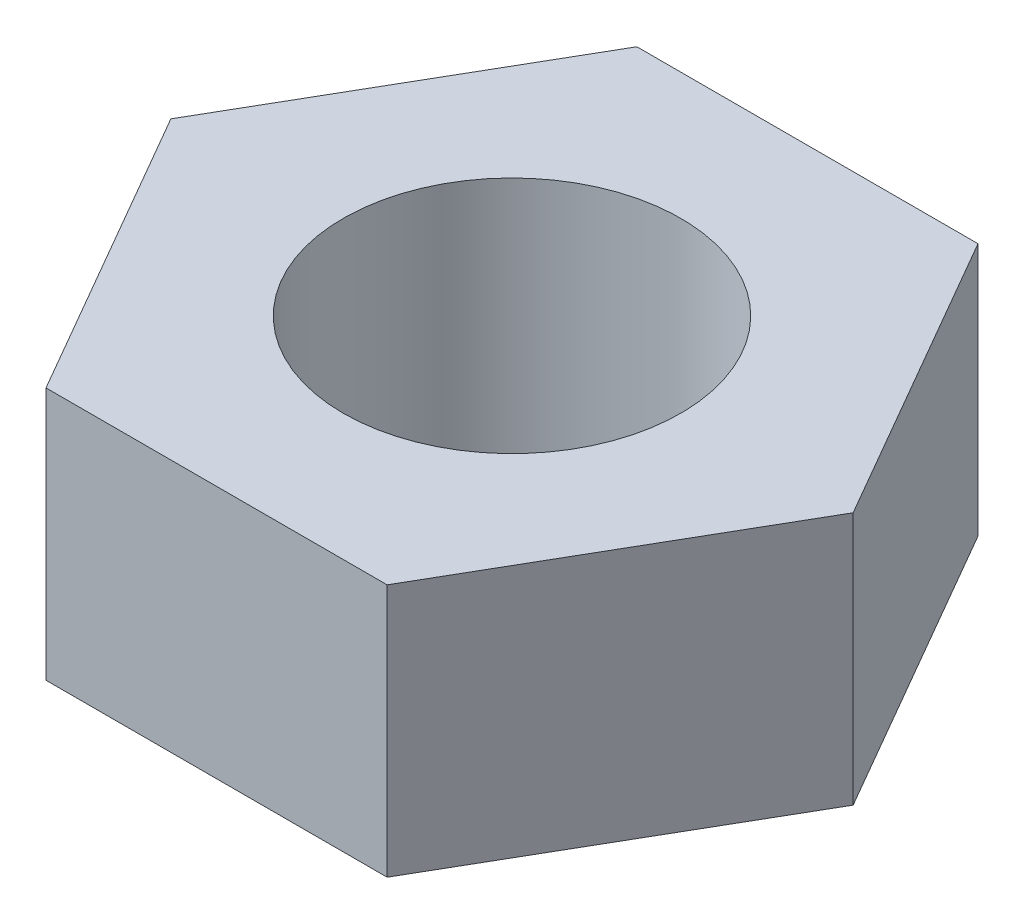
ISO-10303-21;
HEADER;
FILE_DESCRIPTION(('STEP AP214'),'2;1');
FILE_NAME('part.step','',(''),(''),'','','');
FILE_SCHEMA(('AUTOMOTIVE_DESIGN { 1 0 10303 214 1 1 1 1 }'));
ENDSEC;
DATA;
#1=APPLICATION_CONTEXT('core data for automotive mechanical design processes');
#2=APPLICATION_PROTOCOL_DEFINITION('international standard','automotive_design',2000,#1);
#3=PRODUCT_CONTEXT('',#1,'mechanical');
#4=PRODUCT('Part','Part','',(#3));
#5=PRODUCT_RELATED_PRODUCT_CATEGORY('part','',(#4));
#6=PRODUCT_DEFINITION_FORMATION('','',#4);
#7=PRODUCT_DEFINITION_CONTEXT('part definition',#1,'design');
#8=PRODUCT_DEFINITION('design','',#6,#7);
#9=PRODUCT_DEFINITION_SHAPE('','',#8);
#10=(LENGTH_UNIT() NAMED_UNIT(*) SI_UNIT(.MILLI.,.METRE.));
#11=(NAMED_UNIT(*) PLANE_ANGLE_UNIT() SI_UNIT($,.RADIAN.));
#12=(NAMED_UNIT(*) SI_UNIT($,.STERADIAN.) SOLID_ANGLE_UNIT());
#13=UNCERTAINTY_MEASURE_WITH_UNIT(LENGTH_MEASURE(1.E-05),#10,'distance_accuracy_value','');
#14=(GEOMETRIC_REPRESENTATION_CONTEXT(3) GLOBAL_UNCERTAINTY_ASSIGNED_CONTEXT((#13)) GLOBAL_UNIT_ASSIGNED_CONTEXT((#10,
#11,#12)) REPRESENTATION_CONTEXT('',''));
#15=CARTESIAN_POINT('',(0.,0.,0.));
#16=DIRECTION('',(0.,0.,1.));
#17=DIRECTION('',(1.,0.,0.));
#18=AXIS2_PLACEMENT_3D('',#15,#16,#17);
#19=CARTESIAN_POINT('',(0.,3.,0.));
#20=DIRECTION('',(0.,1.,0.));
#21=DIRECTION('',(0.,0.,1.));
#22=AXIS2_PLACEMENT_3D('',#19,#20,#21);
#23=PLANE('',#22);
#24=DIRECTION('',(0.499999999999995,0.,-0.866025403784441));
#25=VECTOR('',#24,1.);
#26=CARTESIAN_POINT('',(2.02072594216373,3.,3.49999999999997));
#27=LINE('',#26,#25);
#28=CARTESIAN_POINT('',(2.02072594216373,3.,3.49999999999997));
#29=VERTEX_POINT('',#28);
#30=CARTESIAN_POINT('',(4.04145188432738,3.,0.));
#31=VERTEX_POINT('',#30);
#32=EDGE_CURVE('E132',#29,#31,#27,.T.);
#33=ORIENTED_EDGE('',*,*,#32,.T.);
#34=DIRECTION('',(-0.500000000000001,0.,-0.866025403784438));
#35=VECTOR('',#34,1.);
#36=CARTESIAN_POINT('',(4.04145188432738,3.,0.));
#37=LINE('',#36,#35);
#38=CARTESIAN_POINT('',(2.02072594216368,3.,-3.5));
#39=VERTEX_POINT('',#38);
#40=EDGE_CURVE('E90',#31,#39,#37,.T.);
#41=ORIENTED_EDGE('',*,*,#40,.T.);
#42=DIRECTION('',(-1.,0.,0.));
#43=VECTOR('',#42,1.);
#44=CARTESIAN_POINT('',(2.02072594216368,3.,-3.5));
#45=LINE('',#44,#43);
#46=CARTESIAN_POINT('',(-2.0207259421637,3.,-3.49999999999999));
#47=VERTEX_POINT('',#46);
#48=EDGE_CURVE('E103',#39,#47,#45,.T.);
#49=ORIENTED_EDGE('',*,*,#48,.T.);
#50=DIRECTION('',(-0.499999999999995,0.,0.866025403784442));
#51=VECTOR('',#50,1.);
#52=CARTESIAN_POINT('',(-2.0207259421637,3.,-3.49999999999999));
#53=LINE('',#52,#51);
#54=CARTESIAN_POINT('',(-4.04145188432738,3.,0.));
#55=VERTEX_POINT('',#54);
#56=EDGE_CURVE('E97',#47,#55,#53,.T.);
#57=ORIENTED_EDGE('',*,*,#56,.T.);
#58=DIRECTION('',(0.500000000000007,0.,0.866025403784435));
#59=VECTOR('',#58,1.);
#60=CARTESIAN_POINT('',(-4.04145188432738,3.,0.));
#61=LINE('',#60,#59);
#62=CARTESIAN_POINT('',(-2.02072594216365,3.,3.50000000000001));
#63=VERTEX_POINT('',#62);
#64=EDGE_CURVE('E101',#55,#63,#61,.T.);
#65=ORIENTED_EDGE('',*,*,#64,.T.);
#66=DIRECTION('',(1.,0.,0.));
#67=VECTOR('',#66,1.);
#68=CARTESIAN_POINT('',(-2.02072594216365,3.,3.50000000000001));
#69=LINE('',#68,#67);
#70=EDGE_CURVE('E53',#63,#29,#69,.T.);
#71=ORIENTED_EDGE('',*,*,#70,.T.);
#72=EDGE_LOOP('',(#33,#41,#49,#57,#65,#71));
#73=FACE_BOUND('',#72,.T.);
#74=CARTESIAN_POINT('',(0.,3.,0.));
#75=DIRECTION('',(0.,1.,0.));
#76=DIRECTION('',(0.,0.,1.));
#77=AXIS2_PLACEMENT_3D('',#74,#75,#76);
#78=CIRCLE('',#77,2.);
#79=CARTESIAN_POINT('',(0.,3.,2.));
#80=VERTEX_POINT('',#79);
#81=EDGE_CURVE('E125',#80,#80,#78,.T.);
#82=ORIENTED_EDGE('',*,*,#81,.F.);
#83=EDGE_LOOP('',(#82));
#84=FACE_BOUND('',#83,.T.);
#85=ADVANCED_FACE('F36',(#73,#84),#23,.T.);
#86=CARTESIAN_POINT('',(0.,0.,0.));
#87=DIRECTION('',(0.,1.,0.));
#88=DIRECTION('',(0.,0.,1.));
#89=AXIS2_PLACEMENT_3D('',#86,#87,#88);
#90=PLANE('',#89);
#91=DIRECTION('',(0.499999999999995,0.,-0.866025403784441));
#92=VECTOR('',#91,1.);
#93=CARTESIAN_POINT('',(2.02072594216373,0.,3.49999999999997));
#94=LINE('',#93,#92);
#95=CARTESIAN_POINT('',(2.02072594216373,0.,3.49999999999997));
#96=VERTEX_POINT('',#95);
#97=CARTESIAN_POINT('',(4.04145188432738,0.,0.));
#98=VERTEX_POINT('',#97);
#99=EDGE_CURVE('E121',#96,#98,#94,.T.);
#100=ORIENTED_EDGE('',*,*,#99,.F.);
#101=DIRECTION('',(1.,0.,0.));
#102=VECTOR('',#101,1.);
#103=CARTESIAN_POINT('',(-2.02072594216365,0.,3.50000000000001));
#104=LINE('',#103,#102);
#105=CARTESIAN_POINT('',(-2.02072594216365,0.,3.50000000000001));
#106=VERTEX_POINT('',#105);
#107=EDGE_CURVE('E82',#106,#96,#104,.T.);
#108=ORIENTED_EDGE('',*,*,#107,.F.);
#109=DIRECTION('',(0.500000000000007,0.,0.866025403784435));
#110=VECTOR('',#109,1.);
#111=CARTESIAN_POINT('',(-4.04145188432738,0.,0.));
#112=LINE('',#111,#110);
#113=CARTESIAN_POINT('',(-4.04145188432738,0.,0.));
#114=VERTEX_POINT('',#113);
#115=EDGE_CURVE('E76',#114,#106,#112,.T.);
#116=ORIENTED_EDGE('',*,*,#115,.F.);
#117=DIRECTION('',(-0.499999999999995,0.,0.866025403784442));
#118=VECTOR('',#117,1.);
#119=CARTESIAN_POINT('',(-2.0207259421637,0.,-3.49999999999999));
#120=LINE('',#119,#118);
#121=CARTESIAN_POINT('',(-2.0207259421637,0.,-3.49999999999999));
#122=VERTEX_POINT('',#121);
#123=EDGE_CURVE('E111',#122,#114,#120,.T.);
#124=ORIENTED_EDGE('',*,*,#123,.F.);
#125=DIRECTION('',(-1.,0.,0.));
#126=VECTOR('',#125,1.);
#127=CARTESIAN_POINT('',(2.02072594216368,0.,-3.5));
#128=LINE('',#127,#126);
#129=CARTESIAN_POINT('',(2.02072594216368,0.,-3.5));
#130=VERTEX_POINT('',#129);
#131=EDGE_CURVE('E127',#130,#122,#128,.T.);
#132=ORIENTED_EDGE('',*,*,#131,.F.);
#133=DIRECTION('',(-0.500000000000001,0.,-0.866025403784438));
#134=VECTOR('',#133,1.);
#135=CARTESIAN_POINT('',(4.04145188432738,0.,0.));
#136=LINE('',#135,#134);
#137=EDGE_CURVE('E124',#98,#130,#136,.T.);
#138=ORIENTED_EDGE('',*,*,#137,.F.);
#139=EDGE_LOOP('',(#100,#108,#116,#124,#132,#138));
#140=FACE_BOUND('',#139,.T.);
#141=CARTESIAN_POINT('',(0.,0.,0.));
#142=DIRECTION('',(0.,1.,0.));
#143=DIRECTION('',(0.,0.,1.));
#144=AXIS2_PLACEMENT_3D('',#141,#142,#143);
#145=CIRCLE('',#144,2.);
#146=CARTESIAN_POINT('',(0.,0.,2.));
#147=VERTEX_POINT('',#146);
#148=EDGE_CURVE('E225',#147,#147,#145,.T.);
#149=ORIENTED_EDGE('',*,*,#148,.T.);
#150=EDGE_LOOP('',(#149));
#151=FACE_BOUND('',#150,.T.);
#152=ADVANCED_FACE('F141',(#140,#151),#90,.F.);
#153=CARTESIAN_POINT('',(2.02072594216373,3.,3.49999999999997));
#154=DIRECTION('',(-0.866025403784441,0.,-0.499999999999995));
#155=DIRECTION('',(-0.499999999999995,0.,0.866025403784441));
#156=AXIS2_PLACEMENT_3D('',#153,#154,#155);
#157=PLANE('',#156);
#158=ORIENTED_EDGE('',*,*,#99,.T.);
#159=DIRECTION('',(0.,-1.,0.));
#160=VECTOR('',#159,1.);
#161=CARTESIAN_POINT('',(4.04145188432738,3.,0.));
#162=LINE('',#161,#160);
#163=EDGE_CURVE('E11',#31,#98,#162,.T.);
#164=ORIENTED_EDGE('',*,*,#163,.F.);
#165=ORIENTED_EDGE('',*,*,#32,.F.);
#166=DIRECTION('',(0.,-1.,0.));
#167=VECTOR('',#166,1.);
#168=CARTESIAN_POINT('',(2.02072594216373,3.,3.49999999999997));
#169=LINE('',#168,#167);
#170=EDGE_CURVE('E117',#29,#96,#169,.T.);
#171=ORIENTED_EDGE('',*,*,#170,.T.);
#172=EDGE_LOOP('',(#158,#164,#165,#171));
#173=FACE_BOUND('',#172,.T.);
#174=ADVANCED_FACE('F38',(#173),#157,.F.);
#175=CARTESIAN_POINT('',(4.04145188432738,3.,0.));
#176=DIRECTION('',(-0.866025403784438,0.,0.500000000000001));
#177=DIRECTION('',(0.500000000000001,0.,0.866025403784438));
#178=AXIS2_PLACEMENT_3D('',#175,#176,#177);
#179=PLANE('',#178);
#180=ORIENTED_EDGE('',*,*,#137,.T.);
#181=DIRECTION('',(0.,-1.,0.));
#182=VECTOR('',#181,1.);
#183=CARTESIAN_POINT('',(2.02072594216368,3.,-3.5));
#184=LINE('',#183,#182);
#185=EDGE_CURVE('E45',#39,#130,#184,.T.);
#186=ORIENTED_EDGE('',*,*,#185,.F.);
#187=ORIENTED_EDGE('',*,*,#40,.F.);
#188=ORIENTED_EDGE('',*,*,#163,.T.);
#189=EDGE_LOOP('',(#180,#186,#187,#188));
#190=FACE_BOUND('',#189,.T.);
#191=ADVANCED_FACE('F166',(#190),#179,.F.);
#192=CARTESIAN_POINT('',(2.02072594216368,3.,-3.5));
#193=DIRECTION('',(0.,0.,1.));
#194=DIRECTION('',(1.,0.,0.));
#195=AXIS2_PLACEMENT_3D('',#192,#193,#194);
#196=PLANE('',#195);
#197=ORIENTED_EDGE('',*,*,#131,.T.);
#198=DIRECTION('',(0.,-1.,0.));
#199=VECTOR('',#198,1.);
#200=CARTESIAN_POINT('',(-2.0207259421637,3.,-3.49999999999999));
#201=LINE('',#200,#199);
#202=EDGE_CURVE('E112',#47,#122,#201,.T.);
#203=ORIENTED_EDGE('',*,*,#202,.F.);
#204=ORIENTED_EDGE('',*,*,#48,.F.);
#205=ORIENTED_EDGE('',*,*,#185,.T.);
#206=EDGE_LOOP('',(#197,#203,#204,#205));
#207=FACE_BOUND('',#206,.T.);
#208=ADVANCED_FACE('F138',(#207),#196,.F.);
#209=CARTESIAN_POINT('',(-2.0207259421637,3.,-3.49999999999999));
#210=DIRECTION('',(0.866025403784441,0.,0.499999999999995));
#211=DIRECTION('',(0.499999999999995,0.,-0.866025403784442));
#212=AXIS2_PLACEMENT_3D('',#209,#210,#211);
#213=PLANE('',#212);
#214=ORIENTED_EDGE('',*,*,#123,.T.);
#215=DIRECTION('',(0.,-1.,0.));
#216=VECTOR('',#215,1.);
#217=CARTESIAN_POINT('',(-4.04145188432738,3.,0.));
#218=LINE('',#217,#216);
#219=EDGE_CURVE('E108',#55,#114,#218,.T.);
#220=ORIENTED_EDGE('',*,*,#219,.F.);
#221=ORIENTED_EDGE('',*,*,#56,.F.);
#222=ORIENTED_EDGE('',*,*,#202,.T.);
#223=EDGE_LOOP('',(#214,#220,#221,#222));
#224=FACE_BOUND('',#223,.T.);
#225=ADVANCED_FACE('F109',(#224),#213,.F.);
#226=CARTESIAN_POINT('',(-4.04145188432738,3.,0.));
#227=DIRECTION('',(0.866025403784434,0.,-0.500000000000007));
#228=DIRECTION('',(-0.500000000000007,0.,-0.866025403784435));
#229=AXIS2_PLACEMENT_3D('',#226,#227,#228);
#230=PLANE('',#229);
#231=ORIENTED_EDGE('',*,*,#115,.T.);
#232=DIRECTION('',(0.,-1.,0.));
#233=VECTOR('',#232,1.);
#234=CARTESIAN_POINT('',(-2.02072594216365,3.,3.50000000000001));
#235=LINE('',#234,#233);
#236=EDGE_CURVE('E113',#63,#106,#235,.T.);
#237=ORIENTED_EDGE('',*,*,#236,.F.);
#238=ORIENTED_EDGE('',*,*,#64,.F.);
#239=ORIENTED_EDGE('',*,*,#219,.T.);
#240=EDGE_LOOP('',(#231,#237,#238,#239));
#241=FACE_BOUND('',#240,.T.);
#242=ADVANCED_FACE('F115',(#241),#230,.F.);
#243=CARTESIAN_POINT('',(-2.02072594216365,3.,3.50000000000001));
#244=DIRECTION('',(0.,0.,-1.));
#245=DIRECTION('',(-1.,0.,0.));
#246=AXIS2_PLACEMENT_3D('',#243,#244,#245);
#247=PLANE('',#246);
#248=ORIENTED_EDGE('',*,*,#107,.T.);
#249=ORIENTED_EDGE('',*,*,#170,.F.);
#250=ORIENTED_EDGE('',*,*,#70,.F.);
#251=ORIENTED_EDGE('',*,*,#236,.T.);
#252=EDGE_LOOP('',(#248,#249,#250,#251));
#253=FACE_BOUND('',#252,.T.);
#254=ADVANCED_FACE('F146',(#253),#247,.F.);
#255=CARTESIAN_POINT('',(0.,3.,0.));
#256=DIRECTION('',(0.,-1.,0.));
#257=DIRECTION('',(0.,0.,-1.));
#258=AXIS2_PLACEMENT_3D('',#255,#256,#257);
#259=CYLINDRICAL_SURFACE('',#258,2.);
#260=ORIENTED_EDGE('',*,*,#81,.T.);
#261=EDGE_LOOP('',(#260));
#262=FACE_BOUND('',#261,.T.);
#263=ORIENTED_EDGE('',*,*,#148,.F.);
#264=EDGE_LOOP('',(#263));
#265=FACE_BOUND('',#264,.T.);
#266=ADVANCED_FACE('F148',(#262,#265),#259,.F.);
#267=CLOSED_SHELL('',(#85,#152,#174,#191,#208,#225,#242,#254,#266));
#268=MANIFOLD_SOLID_BREP('B2',#267);
#269=ADVANCED_BREP_SHAPE_REPRESENTATION('',(#18,#268),#14);
#270=SHAPE_DEFINITION_REPRESENTATION(#9,#269);
ENDSEC;
END-ISO-10303-21;
